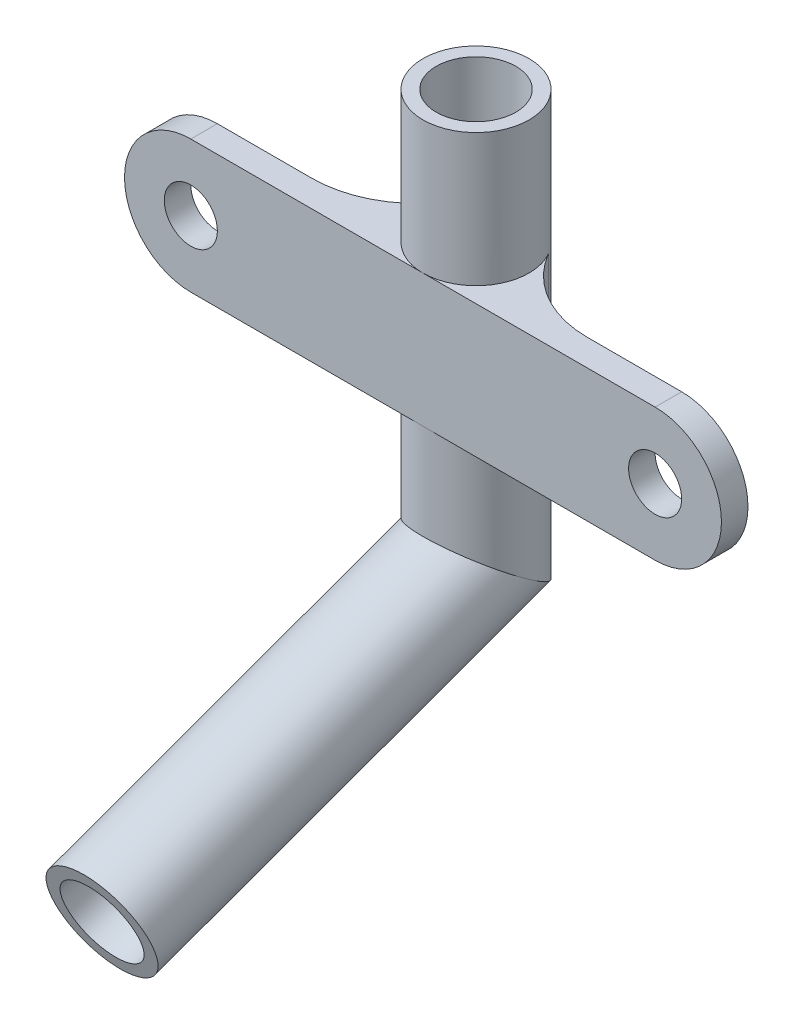
ISO-10303-21;
HEADER;
FILE_DESCRIPTION(('STEP AP214'),'2;1');
FILE_NAME('part.step','',(''),(''),'','','');
FILE_SCHEMA(('AUTOMOTIVE_DESIGN { 1 0 10303 214 1 1 1 1 }'));
ENDSEC;
DATA;
#1=APPLICATION_CONTEXT('core data for automotive mechanical design processes');
#2=APPLICATION_PROTOCOL_DEFINITION('international standard','automotive_design',2000,#1);
#3=PRODUCT_CONTEXT('',#1,'mechanical');
#4=PRODUCT('Part','Part','',(#3));
#5=PRODUCT_RELATED_PRODUCT_CATEGORY('part','',(#4));
#6=PRODUCT_DEFINITION_FORMATION('','',#4);
#7=PRODUCT_DEFINITION_CONTEXT('part definition',#1,'design');
#8=PRODUCT_DEFINITION('design','',#6,#7);
#9=PRODUCT_DEFINITION_SHAPE('','',#8);
#10=(LENGTH_UNIT() NAMED_UNIT(*) SI_UNIT(.MILLI.,.METRE.));
#11=(NAMED_UNIT(*) PLANE_ANGLE_UNIT() SI_UNIT($,.RADIAN.));
#12=(NAMED_UNIT(*) SI_UNIT($,.STERADIAN.) SOLID_ANGLE_UNIT());
#13=UNCERTAINTY_MEASURE_WITH_UNIT(LENGTH_MEASURE(1.E-05),#10,'distance_accuracy_value','');
#14=(GEOMETRIC_REPRESENTATION_CONTEXT(3) GLOBAL_UNCERTAINTY_ASSIGNED_CONTEXT((#13)) GLOBAL_UNIT_ASSIGNED_CONTEXT((#10,
#11,#12)) REPRESENTATION_CONTEXT('',''));
#15=CARTESIAN_POINT('',(0.,0.,0.));
#16=DIRECTION('',(0.,0.,1.));
#17=DIRECTION('',(1.,0.,0.));
#18=AXIS2_PLACEMENT_3D('',#15,#16,#17);
#19=CARTESIAN_POINT('',(0.,0.,0.));
#20=DIRECTION('',(0.,-1.,0.));
#21=DIRECTION('',(0.,0.,-1.));
#22=AXIS2_PLACEMENT_3D('',#19,#20,#21);
#23=CYLINDRICAL_SURFACE('',#22,3.);
#24=CARTESIAN_POINT('',(0.,-30.,0.));
#25=DIRECTION('',(0.,-0.819152044288991,0.573576436351047));
#26=DIRECTION('',(0.,-0.573576436351047,-0.819152044288991));
#27=AXIS2_PLACEMENT_3D('',#24,#25,#26);
#28=ELLIPSE('',#27,3.66232376628437,3.);
#29=CARTESIAN_POINT('',(0.,-32.1006226146291,-3.));
#30=VERTEX_POINT('',#29);
#31=EDGE_CURVE('E208',#30,#30,#28,.F.);
#32=ORIENTED_EDGE('',*,*,#31,.F.);
#33=EDGE_LOOP('',(#32));
#34=FACE_BOUND('',#33,.T.);
#35=CARTESIAN_POINT('',(0.,0.,0.));
#36=DIRECTION('',(0.,1.,0.));
#37=DIRECTION('',(0.,0.,1.));
#38=AXIS2_PLACEMENT_3D('',#35,#36,#37);
#39=CIRCLE('',#38,3.);
#40=CARTESIAN_POINT('',(0.,0.,3.));
#41=VERTEX_POINT('',#40);
#42=EDGE_CURVE('E204',#41,#41,#39,.F.);
#43=ORIENTED_EDGE('',*,*,#42,.F.);
#44=EDGE_LOOP('',(#43));
#45=FACE_BOUND('',#44,.T.);
#46=DIRECTION('',(0.,-1.,0.));
#47=VECTOR('',#46,1.);
#48=CARTESIAN_POINT('',(-2.23606797749979,0.,2.));
#49=LINE('',#48,#47);
#50=CARTESIAN_POINT('',(-2.23606797749979,-20.,2.));
#51=VERTEX_POINT('',#50);
#52=CARTESIAN_POINT('',(-2.23606797749979,-10.,2.));
#53=VERTEX_POINT('',#52);
#54=EDGE_CURVE('E238',#51,#53,#49,.F.);
#55=ORIENTED_EDGE('',*,*,#54,.F.);
#56=CARTESIAN_POINT('',(0.,-20.,0.));
#57=DIRECTION('',(0.,-1.,0.));
#58=DIRECTION('',(1.,0.,0.));
#59=AXIS2_PLACEMENT_3D('',#56,#57,#58);
#60=CIRCLE('',#59,3.);
#61=CARTESIAN_POINT('',(2.23606797749979,-20.,2.));
#62=VERTEX_POINT('',#61);
#63=EDGE_CURVE('E232',#51,#62,#60,.F.);
#64=ORIENTED_EDGE('',*,*,#63,.T.);
#65=DIRECTION('',(0.,-1.,0.));
#66=VECTOR('',#65,1.);
#67=CARTESIAN_POINT('',(2.23606797749979,0.,2.));
#68=LINE('',#67,#66);
#69=CARTESIAN_POINT('',(2.23606797749979,-9.99999999999999,2.));
#70=VERTEX_POINT('',#69);
#71=EDGE_CURVE('E213',#70,#62,#68,.T.);
#72=ORIENTED_EDGE('',*,*,#71,.F.);
#73=CARTESIAN_POINT('',(0.,-10.,0.));
#74=DIRECTION('',(0.,1.,0.));
#75=DIRECTION('',(-1.,0.,0.));
#76=AXIS2_PLACEMENT_3D('',#73,#74,#75);
#77=CIRCLE('',#76,3.);
#78=EDGE_CURVE('E235',#70,#53,#77,.F.);
#79=ORIENTED_EDGE('',*,*,#78,.T.);
#80=EDGE_LOOP('',(#55,#64,#72,#79));
#81=FACE_BOUND('',#80,.T.);
#82=ADVANCED_FACE('F41',(#34,#45,#81),#23,.F.);
#83=CARTESIAN_POINT('',(0.,-28.9120636223322,-2.98908063144566));
#84=DIRECTION('',(0.,-0.342020143325666,0.939692620785909));
#85=DIRECTION('',(0.,-0.939692620785909,-0.342020143325666));
#86=AXIS2_PLACEMENT_3D('',#83,#84,#85);
#87=CYLINDRICAL_SURFACE('',#86,4.);
#88=CARTESIAN_POINT('',(0.,-30.,0.));
#89=DIRECTION('',(0.,-0.819152044288991,0.573576436351047));
#90=DIRECTION('',(0.,-0.573576436351047,-0.819152044288991));
#91=AXIS2_PLACEMENT_3D('',#88,#89,#90);
#92=ELLIPSE('',#91,4.88309835504583,4.);
#93=CARTESIAN_POINT('',(0.,-32.8008301528388,-4.00000000000001));
#94=VERTEX_POINT('',#93);
#95=EDGE_CURVE('E225',#94,#94,#92,.T.);
#96=ORIENTED_EDGE('',*,*,#95,.T.);
#97=EDGE_LOOP('',(#96));
#98=FACE_BOUND('',#97,.T.);
#99=CARTESIAN_POINT('',(0.,-40.26060429977,28.1907786235773));
#100=DIRECTION('',(0.,0.342020143325666,-0.939692620785909));
#101=DIRECTION('',(0.,0.939692620785909,0.342020143325666));
#102=AXIS2_PLACEMENT_3D('',#99,#100,#101);
#103=CIRCLE('',#102,4.);
#104=CARTESIAN_POINT('',(0.,-36.5018338166264,29.5588591968799));
#105=VERTEX_POINT('',#104);
#106=EDGE_CURVE('E221',#105,#105,#103,.T.);
#107=ORIENTED_EDGE('',*,*,#106,.T.);
#108=EDGE_LOOP('',(#107));
#109=FACE_BOUND('',#108,.T.);
#110=ADVANCED_FACE('F307',(#98,#109),#87,.T.);
#111=CARTESIAN_POINT('',(0.,0.,0.));
#112=DIRECTION('',(0.,-1.,0.));
#113=DIRECTION('',(0.,0.,-1.));
#114=AXIS2_PLACEMENT_3D('',#111,#112,#113);
#115=CYLINDRICAL_SURFACE('',#114,4.);
#116=CARTESIAN_POINT('',(0.,-20.,0.));
#117=DIRECTION('',(0.,-1.,0.));
#118=DIRECTION('',(1.,0.,0.));
#119=AXIS2_PLACEMENT_3D('',#116,#117,#118);
#120=CIRCLE('',#119,4.);
#121=CARTESIAN_POINT('',(0.,-20.,4.));
#122=VERTEX_POINT('',#121);
#123=CARTESIAN_POINT('',(-3.46410161513775,-20.,-2.));
#124=VERTEX_POINT('',#123);
#125=EDGE_CURVE('E190',#122,#124,#120,.T.);
#126=ORIENTED_EDGE('',*,*,#125,.T.);
#127=DIRECTION('',(0.,-1.,0.));
#128=VECTOR('',#127,1.);
#129=CARTESIAN_POINT('',(-3.46410161513776,0.,-2.));
#130=LINE('',#129,#128);
#131=CARTESIAN_POINT('',(-3.46410161513775,-10.,-2.));
#132=VERTEX_POINT('',#131);
#133=EDGE_CURVE('E248',#124,#132,#130,.F.);
#134=ORIENTED_EDGE('',*,*,#133,.T.);
#135=CARTESIAN_POINT('',(0.,-10.,0.));
#136=DIRECTION('',(0.,1.,0.));
#137=DIRECTION('',(-1.,0.,0.));
#138=AXIS2_PLACEMENT_3D('',#135,#136,#137);
#139=CIRCLE('',#138,4.);
#140=CARTESIAN_POINT('',(0.,-10.,4.));
#141=VERTEX_POINT('',#140);
#142=EDGE_CURVE('E203',#132,#141,#139,.T.);
#143=ORIENTED_EDGE('',*,*,#142,.T.);
#144=CARTESIAN_POINT('',(3.46410161513775,-10.,-2.));
#145=VERTEX_POINT('',#144);
#146=EDGE_CURVE('E200',#141,#145,#139,.T.);
#147=ORIENTED_EDGE('',*,*,#146,.T.);
#148=DIRECTION('',(0.,-1.,0.));
#149=VECTOR('',#148,1.);
#150=CARTESIAN_POINT('',(3.46410161513776,0.,-2.));
#151=LINE('',#150,#149);
#152=CARTESIAN_POINT('',(3.46410161513775,-20.,-2.));
#153=VERTEX_POINT('',#152);
#154=EDGE_CURVE('E244',#145,#153,#151,.T.);
#155=ORIENTED_EDGE('',*,*,#154,.T.);
#156=EDGE_CURVE('E199',#153,#122,#120,.T.);
#157=ORIENTED_EDGE('',*,*,#156,.T.);
#158=EDGE_LOOP('',(#126,#134,#143,#147,#155,#157));
#159=FACE_BOUND('',#158,.T.);
#160=CARTESIAN_POINT('',(0.,0.,0.));
#161=DIRECTION('',(0.,1.,0.));
#162=DIRECTION('',(0.,0.,1.));
#163=AXIS2_PLACEMENT_3D('',#160,#161,#162);
#164=CIRCLE('',#163,4.);
#165=CARTESIAN_POINT('',(0.,0.,4.));
#166=VERTEX_POINT('',#165);
#167=EDGE_CURVE('E217',#166,#166,#164,.T.);
#168=ORIENTED_EDGE('',*,*,#167,.F.);
#169=EDGE_LOOP('',(#168));
#170=FACE_BOUND('',#169,.T.);
#171=ORIENTED_EDGE('',*,*,#95,.F.);
#172=EDGE_LOOP('',(#171));
#173=FACE_BOUND('',#172,.T.);
#174=ADVANCED_FACE('F268',(#159,#170,#173),#115,.T.);
#175=CARTESIAN_POINT('',(0.,-40.26060429977,28.1907786235773));
#176=DIRECTION('',(0.,0.342020143325666,-0.939692620785909));
#177=DIRECTION('',(0.,0.939692620785909,0.342020143325666));
#178=AXIS2_PLACEMENT_3D('',#175,#176,#177);
#179=PLANE('',#178);
#180=CARTESIAN_POINT('',(0.,-40.26060429977,28.1907786235773));
#181=DIRECTION('',(0.,0.342020143325666,-0.939692620785909));
#182=DIRECTION('',(0.,0.939692620785909,0.342020143325666));
#183=AXIS2_PLACEMENT_3D('',#180,#181,#182);
#184=CIRCLE('',#183,3.);
#185=CARTESIAN_POINT('',(0.,-37.4415264374123,29.2168390535543));
#186=VERTEX_POINT('',#185);
#187=EDGE_CURVE('E209',#186,#186,#184,.F.);
#188=ORIENTED_EDGE('',*,*,#187,.F.);
#189=EDGE_LOOP('',(#188));
#190=FACE_BOUND('',#189,.T.);
#191=ORIENTED_EDGE('',*,*,#106,.F.);
#192=EDGE_LOOP('',(#191));
#193=FACE_BOUND('',#192,.T.);
#194=ADVANCED_FACE('F329',(#190,#193),#179,.F.);
#195=CARTESIAN_POINT('',(0.,0.,0.));
#196=DIRECTION('',(0.,1.,0.));
#197=DIRECTION('',(0.,0.,1.));
#198=AXIS2_PLACEMENT_3D('',#195,#196,#197);
#199=PLANE('',#198);
#200=ORIENTED_EDGE('',*,*,#42,.T.);
#201=EDGE_LOOP('',(#200));
#202=FACE_BOUND('',#201,.T.);
#203=ORIENTED_EDGE('',*,*,#167,.T.);
#204=EDGE_LOOP('',(#203));
#205=FACE_BOUND('',#204,.T.);
#206=ADVANCED_FACE('F321',(#202,#205),#199,.T.);
#207=CARTESIAN_POINT('',(0.,-29.175497213166,-2.2653027891039));
#208=DIRECTION('',(0.,-0.342020143325666,0.939692620785909));
#209=DIRECTION('',(0.,-0.939692620785909,-0.342020143325666));
#210=AXIS2_PLACEMENT_3D('',#207,#208,#209);
#211=CYLINDRICAL_SURFACE('',#210,3.);
#212=ORIENTED_EDGE('',*,*,#31,.T.);
#213=EDGE_LOOP('',(#212));
#214=FACE_BOUND('',#213,.T.);
#215=ORIENTED_EDGE('',*,*,#187,.T.);
#216=EDGE_LOOP('',(#215));
#217=FACE_BOUND('',#216,.T.);
#218=ADVANCED_FACE('F310',(#214,#217),#211,.F.);
#219=CARTESIAN_POINT('',(-17.5,-15.,2.));
#220=DIRECTION('',(0.,0.,1.));
#221=DIRECTION('',(1.,0.,0.));
#222=AXIS2_PLACEMENT_3D('',#219,#220,#221);
#223=PLANE('',#222);
#224=DIRECTION('',(1.,0.,0.));
#225=VECTOR('',#224,1.);
#226=CARTESIAN_POINT('',(17.5,-20.,2.));
#227=LINE('',#226,#225);
#228=EDGE_CURVE('E150',#51,#62,#227,.T.);
#229=ORIENTED_EDGE('',*,*,#228,.F.);
#230=ORIENTED_EDGE('',*,*,#54,.T.);
#231=DIRECTION('',(-1.,0.,0.));
#232=VECTOR('',#231,1.);
#233=CARTESIAN_POINT('',(17.5,-9.99999999999999,2.));
#234=LINE('',#233,#232);
#235=EDGE_CURVE('E176',#70,#53,#234,.T.);
#236=ORIENTED_EDGE('',*,*,#235,.F.);
#237=ORIENTED_EDGE('',*,*,#71,.T.);
#238=EDGE_LOOP('',(#229,#230,#236,#237));
#239=FACE_BOUND('',#238,.T.);
#240=ADVANCED_FACE('F285',(#239),#223,.F.);
#241=CARTESIAN_POINT('',(17.5,-20.,2.));
#242=DIRECTION('',(0.,-1.,0.));
#243=DIRECTION('',(1.,0.,0.));
#244=AXIS2_PLACEMENT_3D('',#241,#242,#243);
#245=PLANE('',#244);
#246=ORIENTED_EDGE('',*,*,#63,.F.);
#247=ORIENTED_EDGE('',*,*,#228,.T.);
#248=EDGE_LOOP('',(#246,#247));
#249=FACE_BOUND('',#248,.T.);
#250=ADVANCED_FACE('F283',(#249),#245,.T.);
#251=CARTESIAN_POINT('',(17.5,-9.99999999999999,2.));
#252=DIRECTION('',(0.,1.,0.));
#253=DIRECTION('',(-1.,0.,0.));
#254=AXIS2_PLACEMENT_3D('',#251,#252,#253);
#255=PLANE('',#254);
#256=ORIENTED_EDGE('',*,*,#78,.F.);
#257=ORIENTED_EDGE('',*,*,#235,.T.);
#258=EDGE_LOOP('',(#256,#257));
#259=FACE_BOUND('',#258,.T.);
#260=ADVANCED_FACE('F290',(#259),#255,.T.);
#261=CARTESIAN_POINT('',(-17.5,-15.,4.));
#262=DIRECTION('',(0.,0.,1.));
#263=DIRECTION('',(1.,0.,0.));
#264=AXIS2_PLACEMENT_3D('',#261,#262,#263);
#265=PLANE('',#264);
#266=CARTESIAN_POINT('',(-17.5,-15.,4.));
#267=DIRECTION('',(0.,0.,1.));
#268=DIRECTION('',(1.,0.,0.));
#269=AXIS2_PLACEMENT_3D('',#266,#267,#268);
#270=CIRCLE('',#269,2.);
#271=CARTESIAN_POINT('',(-15.5,-15.,4.));
#272=VERTEX_POINT('',#271);
#273=EDGE_CURVE('E361',#272,#272,#270,.T.);
#274=ORIENTED_EDGE('',*,*,#273,.F.);
#275=EDGE_LOOP('',(#274));
#276=FACE_BOUND('',#275,.T.);
#277=DIRECTION('',(1.,0.,0.));
#278=VECTOR('',#277,1.);
#279=CARTESIAN_POINT('',(17.5,-20.,4.));
#280=LINE('',#279,#278);
#281=CARTESIAN_POINT('',(-17.5,-20.,4.));
#282=VERTEX_POINT('',#281);
#283=EDGE_CURVE('E131',#282,#122,#280,.T.);
#284=ORIENTED_EDGE('',*,*,#283,.T.);
#285=CARTESIAN_POINT('',(17.5,-20.,4.));
#286=VERTEX_POINT('',#285);
#287=EDGE_CURVE('E180',#122,#286,#280,.T.);
#288=ORIENTED_EDGE('',*,*,#287,.T.);
#289=CARTESIAN_POINT('',(17.5,-15.,4.));
#290=DIRECTION('',(0.,0.,1.));
#291=DIRECTION('',(1.,0.,0.));
#292=AXIS2_PLACEMENT_3D('',#289,#290,#291);
#293=CIRCLE('',#292,5.);
#294=CARTESIAN_POINT('',(17.5,-9.99999999999999,4.));
#295=VERTEX_POINT('',#294);
#296=EDGE_CURVE('E184',#286,#295,#293,.T.);
#297=ORIENTED_EDGE('',*,*,#296,.T.);
#298=DIRECTION('',(-1.,0.,0.));
#299=VECTOR('',#298,1.);
#300=CARTESIAN_POINT('',(17.5,-9.99999999999999,4.));
#301=LINE('',#300,#299);
#302=EDGE_CURVE('E158',#295,#141,#301,.T.);
#303=ORIENTED_EDGE('',*,*,#302,.T.);
#304=CARTESIAN_POINT('',(-17.5,-10.,4.));
#305=VERTEX_POINT('',#304);
#306=EDGE_CURVE('E163',#141,#305,#301,.T.);
#307=ORIENTED_EDGE('',*,*,#306,.T.);
#308=CARTESIAN_POINT('',(-17.5,-15.,4.));
#309=DIRECTION('',(0.,0.,1.));
#310=DIRECTION('',(1.,0.,0.));
#311=AXIS2_PLACEMENT_3D('',#308,#309,#310);
#312=CIRCLE('',#311,5.);
#313=EDGE_CURVE('E177',#305,#282,#312,.T.);
#314=ORIENTED_EDGE('',*,*,#313,.T.);
#315=EDGE_LOOP('',(#284,#288,#297,#303,#307,#314));
#316=FACE_BOUND('',#315,.T.);
#317=CARTESIAN_POINT('',(17.5,-15.,4.));
#318=DIRECTION('',(0.,0.,1.));
#319=DIRECTION('',(1.,0.,0.));
#320=AXIS2_PLACEMENT_3D('',#317,#318,#319);
#321=CIRCLE('',#320,2.);
#322=CARTESIAN_POINT('',(19.5,-15.,4.));
#323=VERTEX_POINT('',#322);
#324=EDGE_CURVE('E166',#323,#323,#321,.T.);
#325=ORIENTED_EDGE('',*,*,#324,.F.);
#326=EDGE_LOOP('',(#325));
#327=FACE_BOUND('',#326,.T.);
#328=ADVANCED_FACE('F292',(#276,#316,#327),#265,.T.);
#329=ORIENTED_EDGE('',*,*,#142,.F.);
#330=CARTESIAN_POINT('',(-10.3923048454133,-10.,-6.));
#331=DIRECTION('',(0.,1.,0.));
#332=DIRECTION('',(-1.,0.,0.));
#333=AXIS2_PLACEMENT_3D('',#330,#331,#332);
#334=CIRCLE('',#333,8.);
#335=CARTESIAN_POINT('',(-10.3923048454133,-10.,2.));
#336=VERTEX_POINT('',#335);
#337=EDGE_CURVE('E258',#132,#336,#334,.F.);
#338=ORIENTED_EDGE('',*,*,#337,.T.);
#339=CARTESIAN_POINT('',(-17.5,-10.,2.));
#340=VERTEX_POINT('',#339);
#341=EDGE_CURVE('E172',#336,#340,#234,.T.);
#342=ORIENTED_EDGE('',*,*,#341,.T.);
#343=DIRECTION('',(0.,0.,1.));
#344=VECTOR('',#343,1.);
#345=CARTESIAN_POINT('',(-17.5,-10.,2.));
#346=LINE('',#345,#344);
#347=EDGE_CURVE('E156',#340,#305,#346,.T.);
#348=ORIENTED_EDGE('',*,*,#347,.T.);
#349=ORIENTED_EDGE('',*,*,#306,.F.);
#350=EDGE_LOOP('',(#329,#338,#342,#348,#349));
#351=FACE_BOUND('',#350,.T.);
#352=ADVANCED_FACE('F294',(#351),#255,.T.);
#353=ORIENTED_EDGE('',*,*,#146,.F.);
#354=ORIENTED_EDGE('',*,*,#302,.F.);
#355=DIRECTION('',(0.,0.,1.));
#356=VECTOR('',#355,1.);
#357=CARTESIAN_POINT('',(17.5,-9.99999999999999,2.));
#358=LINE('',#357,#356);
#359=CARTESIAN_POINT('',(17.5,-9.99999999999999,2.));
#360=VERTEX_POINT('',#359);
#361=EDGE_CURVE('E191',#360,#295,#358,.T.);
#362=ORIENTED_EDGE('',*,*,#361,.F.);
#363=CARTESIAN_POINT('',(10.3923048454133,-10.,2.));
#364=VERTEX_POINT('',#363);
#365=EDGE_CURVE('E138',#360,#364,#234,.T.);
#366=ORIENTED_EDGE('',*,*,#365,.T.);
#367=CARTESIAN_POINT('',(10.3923048454133,-10.,-6.));
#368=DIRECTION('',(0.,1.,0.));
#369=DIRECTION('',(-1.,0.,0.));
#370=AXIS2_PLACEMENT_3D('',#367,#368,#369);
#371=CIRCLE('',#370,8.);
#372=EDGE_CURVE('E50',#364,#145,#371,.F.);
#373=ORIENTED_EDGE('',*,*,#372,.T.);
#374=EDGE_LOOP('',(#353,#354,#362,#366,#373));
#375=FACE_BOUND('',#374,.T.);
#376=ADVANCED_FACE('F263',(#375),#255,.T.);
#377=ORIENTED_EDGE('',*,*,#156,.F.);
#378=CARTESIAN_POINT('',(10.3923048454133,-20.,-6.));
#379=DIRECTION('',(0.,-1.,0.));
#380=DIRECTION('',(1.,0.,0.));
#381=AXIS2_PLACEMENT_3D('',#378,#379,#380);
#382=CIRCLE('',#381,8.);
#383=CARTESIAN_POINT('',(10.3923048454133,-20.,2.));
#384=VERTEX_POINT('',#383);
#385=EDGE_CURVE('E11',#153,#384,#382,.F.);
#386=ORIENTED_EDGE('',*,*,#385,.T.);
#387=CARTESIAN_POINT('',(17.5,-20.,2.));
#388=VERTEX_POINT('',#387);
#389=EDGE_CURVE('E152',#384,#388,#227,.T.);
#390=ORIENTED_EDGE('',*,*,#389,.T.);
#391=DIRECTION('',(0.,0.,1.));
#392=VECTOR('',#391,1.);
#393=CARTESIAN_POINT('',(17.5,-20.,2.));
#394=LINE('',#393,#392);
#395=EDGE_CURVE('E137',#388,#286,#394,.T.);
#396=ORIENTED_EDGE('',*,*,#395,.T.);
#397=ORIENTED_EDGE('',*,*,#287,.F.);
#398=EDGE_LOOP('',(#377,#386,#390,#396,#397));
#399=FACE_BOUND('',#398,.T.);
#400=ADVANCED_FACE('F302',(#399),#245,.T.);
#401=ORIENTED_EDGE('',*,*,#125,.F.);
#402=ORIENTED_EDGE('',*,*,#283,.F.);
#403=DIRECTION('',(0.,0.,1.));
#404=VECTOR('',#403,1.);
#405=CARTESIAN_POINT('',(-17.5,-20.,2.));
#406=LINE('',#405,#404);
#407=CARTESIAN_POINT('',(-17.5,-20.,2.));
#408=VERTEX_POINT('',#407);
#409=EDGE_CURVE('E124',#408,#282,#406,.T.);
#410=ORIENTED_EDGE('',*,*,#409,.F.);
#411=CARTESIAN_POINT('',(-10.3923048454133,-20.,2.));
#412=VERTEX_POINT('',#411);
#413=EDGE_CURVE('E129',#408,#412,#227,.T.);
#414=ORIENTED_EDGE('',*,*,#413,.T.);
#415=CARTESIAN_POINT('',(-10.3923048454133,-20.,-6.));
#416=DIRECTION('',(0.,-1.,0.));
#417=DIRECTION('',(1.,0.,0.));
#418=AXIS2_PLACEMENT_3D('',#415,#416,#417);
#419=CIRCLE('',#418,8.);
#420=EDGE_CURVE('E255',#412,#124,#419,.F.);
#421=ORIENTED_EDGE('',*,*,#420,.T.);
#422=EDGE_LOOP('',(#401,#402,#410,#414,#421));
#423=FACE_BOUND('',#422,.T.);
#424=ADVANCED_FACE('F127',(#423),#245,.T.);
#425=CARTESIAN_POINT('',(-17.5,-15.,2.));
#426=DIRECTION('',(0.,0.,1.));
#427=DIRECTION('',(1.,0.,0.));
#428=AXIS2_PLACEMENT_3D('',#425,#426,#427);
#429=CIRCLE('',#428,2.);
#430=CARTESIAN_POINT('',(-15.5,-15.,2.));
#431=VERTEX_POINT('',#430);
#432=EDGE_CURVE('E358',#431,#431,#429,.T.);
#433=ORIENTED_EDGE('',*,*,#432,.T.);
#434=EDGE_LOOP('',(#433));
#435=FACE_BOUND('',#434,.T.);
#436=ORIENTED_EDGE('',*,*,#341,.F.);
#437=DIRECTION('',(0.,1.,0.));
#438=VECTOR('',#437,1.);
#439=CARTESIAN_POINT('',(-10.3923048454133,-20.,2.));
#440=LINE('',#439,#438);
#441=EDGE_CURVE('E147',#336,#412,#440,.F.);
#442=ORIENTED_EDGE('',*,*,#441,.T.);
#443=ORIENTED_EDGE('',*,*,#413,.F.);
#444=CARTESIAN_POINT('',(-17.5,-15.,2.));
#445=DIRECTION('',(0.,0.,1.));
#446=DIRECTION('',(1.,0.,0.));
#447=AXIS2_PLACEMENT_3D('',#444,#445,#446);
#448=CIRCLE('',#447,5.);
#449=EDGE_CURVE('E145',#340,#408,#448,.T.);
#450=ORIENTED_EDGE('',*,*,#449,.F.);
#451=EDGE_LOOP('',(#436,#442,#443,#450));
#452=FACE_BOUND('',#451,.T.);
#453=ADVANCED_FACE('F144',(#435,#452),#223,.F.);
#454=CARTESIAN_POINT('',(17.5,-15.,2.));
#455=DIRECTION('',(0.,0.,1.));
#456=DIRECTION('',(1.,0.,0.));
#457=AXIS2_PLACEMENT_3D('',#454,#455,#456);
#458=CIRCLE('',#457,2.);
#459=CARTESIAN_POINT('',(19.5,-15.,2.));
#460=VERTEX_POINT('',#459);
#461=EDGE_CURVE('E181',#460,#460,#458,.T.);
#462=ORIENTED_EDGE('',*,*,#461,.T.);
#463=EDGE_LOOP('',(#462));
#464=FACE_BOUND('',#463,.T.);
#465=ORIENTED_EDGE('',*,*,#389,.F.);
#466=DIRECTION('',(0.,1.,0.));
#467=VECTOR('',#466,1.);
#468=CARTESIAN_POINT('',(10.3923048454133,-10.,2.));
#469=LINE('',#468,#467);
#470=EDGE_CURVE('E252',#384,#364,#469,.T.);
#471=ORIENTED_EDGE('',*,*,#470,.T.);
#472=ORIENTED_EDGE('',*,*,#365,.F.);
#473=CARTESIAN_POINT('',(17.5,-15.,2.));
#474=DIRECTION('',(0.,0.,1.));
#475=DIRECTION('',(1.,0.,0.));
#476=AXIS2_PLACEMENT_3D('',#473,#474,#475);
#477=CIRCLE('',#476,5.);
#478=EDGE_CURVE('E149',#388,#360,#477,.T.);
#479=ORIENTED_EDGE('',*,*,#478,.F.);
#480=EDGE_LOOP('',(#465,#471,#472,#479));
#481=FACE_BOUND('',#480,.T.);
#482=ADVANCED_FACE('F328',(#464,#481),#223,.F.);
#483=CARTESIAN_POINT('',(-17.5,-15.,2.));
#484=DIRECTION('',(0.,0.,1.));
#485=DIRECTION('',(1.,0.,0.));
#486=AXIS2_PLACEMENT_3D('',#483,#484,#485);
#487=CYLINDRICAL_SURFACE('',#486,5.);
#488=ORIENTED_EDGE('',*,*,#313,.F.);
#489=ORIENTED_EDGE('',*,*,#347,.F.);
#490=ORIENTED_EDGE('',*,*,#449,.T.);
#491=ORIENTED_EDGE('',*,*,#409,.T.);
#492=EDGE_LOOP('',(#488,#489,#490,#491));
#493=FACE_BOUND('',#492,.T.);
#494=ADVANCED_FACE('F154',(#493),#487,.T.);
#495=CARTESIAN_POINT('',(17.5,-15.,2.));
#496=DIRECTION('',(0.,0.,1.));
#497=DIRECTION('',(1.,0.,0.));
#498=AXIS2_PLACEMENT_3D('',#495,#496,#497);
#499=CYLINDRICAL_SURFACE('',#498,5.);
#500=ORIENTED_EDGE('',*,*,#296,.F.);
#501=ORIENTED_EDGE('',*,*,#395,.F.);
#502=ORIENTED_EDGE('',*,*,#478,.T.);
#503=ORIENTED_EDGE('',*,*,#361,.T.);
#504=EDGE_LOOP('',(#500,#501,#502,#503));
#505=FACE_BOUND('',#504,.T.);
#506=ADVANCED_FACE('F377',(#505),#499,.T.);
#507=CARTESIAN_POINT('',(17.5,-15.,2.));
#508=DIRECTION('',(0.,0.,1.));
#509=DIRECTION('',(1.,0.,0.));
#510=AXIS2_PLACEMENT_3D('',#507,#508,#509);
#511=CYLINDRICAL_SURFACE('',#510,2.);
#512=ORIENTED_EDGE('',*,*,#461,.F.);
#513=EDGE_LOOP('',(#512));
#514=FACE_BOUND('',#513,.T.);
#515=ORIENTED_EDGE('',*,*,#324,.T.);
#516=EDGE_LOOP('',(#515));
#517=FACE_BOUND('',#516,.T.);
#518=ADVANCED_FACE('F346',(#514,#517),#511,.F.);
#519=CARTESIAN_POINT('',(-17.5,-15.,2.));
#520=DIRECTION('',(0.,0.,1.));
#521=DIRECTION('',(1.,0.,0.));
#522=AXIS2_PLACEMENT_3D('',#519,#520,#521);
#523=CYLINDRICAL_SURFACE('',#522,2.);
#524=ORIENTED_EDGE('',*,*,#432,.F.);
#525=EDGE_LOOP('',(#524));
#526=FACE_BOUND('',#525,.T.);
#527=ORIENTED_EDGE('',*,*,#273,.T.);
#528=EDGE_LOOP('',(#527));
#529=FACE_BOUND('',#528,.T.);
#530=ADVANCED_FACE('F340',(#526,#529),#523,.F.);
#531=CARTESIAN_POINT('',(-10.3923048454133,0.,-6.));
#532=DIRECTION('',(0.,-1.,0.));
#533=DIRECTION('',(0.,0.,-1.));
#534=AXIS2_PLACEMENT_3D('',#531,#532,#533);
#535=CYLINDRICAL_SURFACE('',#534,8.);
#536=ORIENTED_EDGE('',*,*,#337,.F.);
#537=ORIENTED_EDGE('',*,*,#133,.F.);
#538=ORIENTED_EDGE('',*,*,#420,.F.);
#539=ORIENTED_EDGE('',*,*,#441,.F.);
#540=EDGE_LOOP('',(#536,#537,#538,#539));
#541=FACE_BOUND('',#540,.T.);
#542=ADVANCED_FACE('F338',(#541),#535,.F.);
#543=CARTESIAN_POINT('',(10.3923048454133,0.,-6.));
#544=DIRECTION('',(0.,-1.,0.));
#545=DIRECTION('',(0.,0.,-1.));
#546=AXIS2_PLACEMENT_3D('',#543,#544,#545);
#547=CYLINDRICAL_SURFACE('',#546,8.);
#548=ORIENTED_EDGE('',*,*,#385,.F.);
#549=ORIENTED_EDGE('',*,*,#154,.F.);
#550=ORIENTED_EDGE('',*,*,#372,.F.);
#551=ORIENTED_EDGE('',*,*,#470,.F.);
#552=EDGE_LOOP('',(#548,#549,#550,#551));
#553=FACE_BOUND('',#552,.T.);
#554=ADVANCED_FACE('F43',(#553),#547,.F.);
#555=CLOSED_SHELL('',(#82,#110,#174,#194,#206,#218,#240,#250,#260,#328,#352,#376,#400,#424,#453,
#482,#494,#506,#518,#530,#542,#554));
#556=MANIFOLD_SOLID_BREP('B2',#555);
#557=ADVANCED_BREP_SHAPE_REPRESENTATION('',(#18,#556),#14);
#558=SHAPE_DEFINITION_REPRESENTATION(#9,#557);
ENDSEC;
END-ISO-10303-21;
